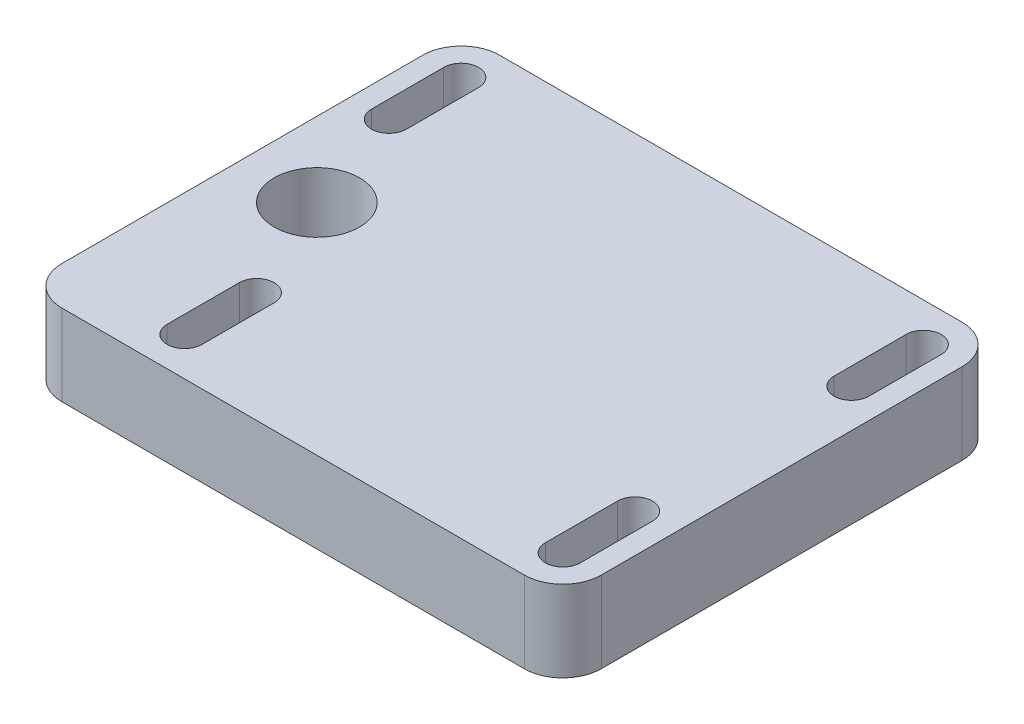
ISO-10303-21;
HEADER;
FILE_DESCRIPTION(('STEP AP214'),'2;1');
FILE_NAME('part.step','',(''),(''),'','','');
FILE_SCHEMA(('AUTOMOTIVE_DESIGN { 1 0 10303 214 1 1 1 1 }'));
ENDSEC;
DATA;
#1=APPLICATION_CONTEXT('core data for automotive mechanical design processes');
#2=APPLICATION_PROTOCOL_DEFINITION('international standard','automotive_design',2000,#1);
#3=PRODUCT_CONTEXT('',#1,'mechanical');
#4=PRODUCT('Part','Part','',(#3));
#5=PRODUCT_RELATED_PRODUCT_CATEGORY('part','',(#4));
#6=PRODUCT_DEFINITION_FORMATION('','',#4);
#7=PRODUCT_DEFINITION_CONTEXT('part definition',#1,'design');
#8=PRODUCT_DEFINITION('design','',#6,#7);
#9=PRODUCT_DEFINITION_SHAPE('','',#8);
#10=(LENGTH_UNIT() NAMED_UNIT(*) SI_UNIT(.MILLI.,.METRE.));
#11=(NAMED_UNIT(*) PLANE_ANGLE_UNIT() SI_UNIT($,.RADIAN.));
#12=(NAMED_UNIT(*) SI_UNIT($,.STERADIAN.) SOLID_ANGLE_UNIT());
#13=UNCERTAINTY_MEASURE_WITH_UNIT(LENGTH_MEASURE(1.E-05),#10,'distance_accuracy_value','');
#14=(GEOMETRIC_REPRESENTATION_CONTEXT(3) GLOBAL_UNCERTAINTY_ASSIGNED_CONTEXT((#13)) GLOBAL_UNIT_ASSIGNED_CONTEXT((#10,
#11,#12)) REPRESENTATION_CONTEXT('',''));
#15=CARTESIAN_POINT('',(0.,0.,0.));
#16=DIRECTION('',(0.,0.,1.));
#17=DIRECTION('',(1.,0.,0.));
#18=AXIS2_PLACEMENT_3D('',#15,#16,#17);
#19=CARTESIAN_POINT('',(0.,6.55,0.));
#20=DIRECTION('',(0.,1.,0.));
#21=DIRECTION('',(0.,0.,1.));
#22=AXIS2_PLACEMENT_3D('',#19,#20,#21);
#23=PLANE('',#22);
#24=CARTESIAN_POINT('',(10.,6.55,-3.00000000000002));
#25=DIRECTION('',(0.,1.,0.));
#26=DIRECTION('',(0.,0.,1.));
#27=AXIS2_PLACEMENT_3D('',#24,#25,#26);
#28=CIRCLE('',#27,1.45);
#29=CARTESIAN_POINT('',(8.55,6.55,-3.00000000000002));
#30=VERTEX_POINT('',#29);
#31=CARTESIAN_POINT('',(11.45,6.55,-3.00000000000002));
#32=VERTEX_POINT('',#31);
#33=EDGE_CURVE('E232',#30,#32,#28,.T.);
#34=ORIENTED_EDGE('',*,*,#33,.F.);
#35=DIRECTION('',(0.,0.,1.));
#36=VECTOR('',#35,1.);
#37=CARTESIAN_POINT('',(8.55000000000001,6.55,0.));
#38=LINE('',#37,#36);
#39=CARTESIAN_POINT('',(8.55,6.55,-9.00000000000002));
#40=VERTEX_POINT('',#39);
#41=EDGE_CURVE('E242',#40,#30,#38,.T.);
#42=ORIENTED_EDGE('',*,*,#41,.F.);
#43=CARTESIAN_POINT('',(10.,6.55,-9.00000000000002));
#44=DIRECTION('',(0.,1.,0.));
#45=DIRECTION('',(0.,0.,1.));
#46=AXIS2_PLACEMENT_3D('',#43,#44,#45);
#47=CIRCLE('',#46,1.45);
#48=CARTESIAN_POINT('',(11.45,6.55,-9.00000000000002));
#49=VERTEX_POINT('',#48);
#50=EDGE_CURVE('E231',#49,#40,#47,.T.);
#51=ORIENTED_EDGE('',*,*,#50,.F.);
#52=DIRECTION('',(0.,0.,-1.));
#53=VECTOR('',#52,1.);
#54=CARTESIAN_POINT('',(11.45,6.55,0.));
#55=LINE('',#54,#53);
#56=EDGE_CURVE('E228',#32,#49,#55,.T.);
#57=ORIENTED_EDGE('',*,*,#56,.F.);
#58=EDGE_LOOP('',(#34,#42,#51,#57));
#59=FACE_BOUND('',#58,.T.);
#60=CARTESIAN_POINT('',(41.45,6.55,-3.00000000000002));
#61=DIRECTION('',(0.,1.,0.));
#62=DIRECTION('',(0.,0.,1.));
#63=AXIS2_PLACEMENT_3D('',#60,#61,#62);
#64=CIRCLE('',#63,1.45);
#65=CARTESIAN_POINT('',(40.,6.55,-3.00000000000002));
#66=VERTEX_POINT('',#65);
#67=CARTESIAN_POINT('',(42.9,6.55,-3.00000000000002));
#68=VERTEX_POINT('',#67);
#69=EDGE_CURVE('E249',#66,#68,#64,.T.);
#70=ORIENTED_EDGE('',*,*,#69,.F.);
#71=DIRECTION('',(0.,0.,1.));
#72=VECTOR('',#71,1.);
#73=CARTESIAN_POINT('',(40.,6.55,0.));
#74=LINE('',#73,#72);
#75=CARTESIAN_POINT('',(40.,6.55,-9.00000000000002));
#76=VERTEX_POINT('',#75);
#77=EDGE_CURVE('E253',#76,#66,#74,.T.);
#78=ORIENTED_EDGE('',*,*,#77,.F.);
#79=CARTESIAN_POINT('',(41.45,6.55,-9.00000000000002));
#80=DIRECTION('',(0.,1.,0.));
#81=DIRECTION('',(0.,0.,1.));
#82=AXIS2_PLACEMENT_3D('',#79,#80,#81);
#83=CIRCLE('',#82,1.45);
#84=CARTESIAN_POINT('',(42.9,6.55,-9.00000000000002));
#85=VERTEX_POINT('',#84);
#86=EDGE_CURVE('E257',#85,#76,#83,.T.);
#87=ORIENTED_EDGE('',*,*,#86,.F.);
#88=DIRECTION('',(0.,0.,-1.));
#89=VECTOR('',#88,1.);
#90=CARTESIAN_POINT('',(42.9,6.55,0.));
#91=LINE('',#90,#89);
#92=EDGE_CURVE('E252',#68,#85,#91,.T.);
#93=ORIENTED_EDGE('',*,*,#92,.F.);
#94=EDGE_LOOP('',(#70,#78,#87,#93));
#95=FACE_BOUND('',#94,.T.);
#96=CARTESIAN_POINT('',(41.45,6.55,-33.));
#97=DIRECTION('',(0.,1.,0.));
#98=DIRECTION('',(0.,0.,1.));
#99=AXIS2_PLACEMENT_3D('',#96,#97,#98);
#100=CIRCLE('',#99,1.45);
#101=CARTESIAN_POINT('',(42.9,6.55,-33.));
#102=VERTEX_POINT('',#101);
#103=CARTESIAN_POINT('',(40.,6.55,-33.));
#104=VERTEX_POINT('',#103);
#105=EDGE_CURVE('E262',#102,#104,#100,.T.);
#106=ORIENTED_EDGE('',*,*,#105,.F.);
#107=DIRECTION('',(0.,0.,-1.));
#108=VECTOR('',#107,1.);
#109=CARTESIAN_POINT('',(42.9,6.55,0.));
#110=LINE('',#109,#108);
#111=CARTESIAN_POINT('',(42.9,6.55,-27.));
#112=VERTEX_POINT('',#111);
#113=EDGE_CURVE('E266',#112,#102,#110,.T.);
#114=ORIENTED_EDGE('',*,*,#113,.F.);
#115=CARTESIAN_POINT('',(41.45,6.55,-27.));
#116=DIRECTION('',(0.,1.,0.));
#117=DIRECTION('',(0.,0.,1.));
#118=AXIS2_PLACEMENT_3D('',#115,#116,#117);
#119=CIRCLE('',#118,1.45);
#120=CARTESIAN_POINT('',(40.,6.55,-27.));
#121=VERTEX_POINT('',#120);
#122=EDGE_CURVE('E270',#121,#112,#119,.T.);
#123=ORIENTED_EDGE('',*,*,#122,.F.);
#124=DIRECTION('',(0.,0.,1.));
#125=VECTOR('',#124,1.);
#126=CARTESIAN_POINT('',(40.,6.55,0.));
#127=LINE('',#126,#125);
#128=EDGE_CURVE('E264',#104,#121,#127,.T.);
#129=ORIENTED_EDGE('',*,*,#128,.F.);
#130=EDGE_LOOP('',(#106,#114,#123,#129));
#131=FACE_BOUND('',#130,.T.);
#132=CARTESIAN_POINT('',(3.,6.55,-33.));
#133=DIRECTION('',(0.,1.,0.));
#134=DIRECTION('',(0.,0.,1.));
#135=AXIS2_PLACEMENT_3D('',#132,#133,#134);
#136=CIRCLE('',#135,1.45);
#137=CARTESIAN_POINT('',(4.45,6.55,-33.));
#138=VERTEX_POINT('',#137);
#139=CARTESIAN_POINT('',(1.55,6.55,-33.));
#140=VERTEX_POINT('',#139);
#141=EDGE_CURVE('E275',#138,#140,#136,.T.);
#142=ORIENTED_EDGE('',*,*,#141,.F.);
#143=DIRECTION('',(0.,0.,-1.));
#144=VECTOR('',#143,1.);
#145=CARTESIAN_POINT('',(4.45,6.55,0.));
#146=LINE('',#145,#144);
#147=CARTESIAN_POINT('',(4.45,6.55,-27.));
#148=VERTEX_POINT('',#147);
#149=EDGE_CURVE('E198',#148,#138,#146,.T.);
#150=ORIENTED_EDGE('',*,*,#149,.F.);
#151=CARTESIAN_POINT('',(3.,6.55,-27.));
#152=DIRECTION('',(0.,1.,0.));
#153=DIRECTION('',(0.,0.,1.));
#154=AXIS2_PLACEMENT_3D('',#151,#152,#153);
#155=CIRCLE('',#154,1.45);
#156=CARTESIAN_POINT('',(1.55,6.55,-27.));
#157=VERTEX_POINT('',#156);
#158=EDGE_CURVE('E280',#157,#148,#155,.T.);
#159=ORIENTED_EDGE('',*,*,#158,.F.);
#160=DIRECTION('',(0.,0.,1.));
#161=VECTOR('',#160,1.);
#162=CARTESIAN_POINT('',(1.55,6.55,0.));
#163=LINE('',#162,#161);
#164=EDGE_CURVE('E277',#140,#157,#163,.T.);
#165=ORIENTED_EDGE('',*,*,#164,.F.);
#166=EDGE_LOOP('',(#142,#150,#159,#165));
#167=FACE_BOUND('',#166,.T.);
#168=DIRECTION('',(0.,0.,1.));
#169=VECTOR('',#168,1.);
#170=CARTESIAN_POINT('',(-0.2,6.55,-36.));
#171=LINE('',#170,#169);
#172=CARTESIAN_POINT('',(-0.2,6.55,-33.));
#173=VERTEX_POINT('',#172);
#174=CARTESIAN_POINT('',(-0.2,6.55,-3.));
#175=VERTEX_POINT('',#174);
#176=EDGE_CURVE('E405',#173,#175,#171,.T.);
#177=ORIENTED_EDGE('',*,*,#176,.T.);
#178=CARTESIAN_POINT('',(3.,6.55,-3.));
#179=DIRECTION('',(0.,1.,0.));
#180=DIRECTION('',(0.,0.,1.));
#181=AXIS2_PLACEMENT_3D('',#178,#179,#180);
#182=CIRCLE('',#181,3.2);
#183=CARTESIAN_POINT('',(3.,6.55,0.2));
#184=VERTEX_POINT('',#183);
#185=EDGE_CURVE('E411',#175,#184,#182,.T.);
#186=ORIENTED_EDGE('',*,*,#185,.T.);
#187=DIRECTION('',(1.,0.,0.));
#188=VECTOR('',#187,1.);
#189=CARTESIAN_POINT('',(0.,6.55,0.2));
#190=LINE('',#189,#188);
#191=CARTESIAN_POINT('',(41.45,6.55,0.2));
#192=VERTEX_POINT('',#191);
#193=EDGE_CURVE('E388',#184,#192,#190,.T.);
#194=ORIENTED_EDGE('',*,*,#193,.T.);
#195=CARTESIAN_POINT('',(41.45,6.55,-3.));
#196=DIRECTION('',(0.,1.,0.));
#197=DIRECTION('',(0.,0.,1.));
#198=AXIS2_PLACEMENT_3D('',#195,#196,#197);
#199=CIRCLE('',#198,3.2);
#200=CARTESIAN_POINT('',(44.65,6.55,-3.));
#201=VERTEX_POINT('',#200);
#202=EDGE_CURVE('E394',#192,#201,#199,.T.);
#203=ORIENTED_EDGE('',*,*,#202,.T.);
#204=DIRECTION('',(0.,0.,-1.));
#205=VECTOR('',#204,1.);
#206=CARTESIAN_POINT('',(44.65,6.55,0.));
#207=LINE('',#206,#205);
#208=CARTESIAN_POINT('',(44.65,6.55,-33.));
#209=VERTEX_POINT('',#208);
#210=EDGE_CURVE('E385',#201,#209,#207,.T.);
#211=ORIENTED_EDGE('',*,*,#210,.T.);
#212=CARTESIAN_POINT('',(41.45,6.55,-33.));
#213=DIRECTION('',(0.,1.,0.));
#214=DIRECTION('',(0.,0.,1.));
#215=AXIS2_PLACEMENT_3D('',#212,#213,#214);
#216=CIRCLE('',#215,3.2);
#217=CARTESIAN_POINT('',(41.45,6.55,-36.2));
#218=VERTEX_POINT('',#217);
#219=EDGE_CURVE('E397',#209,#218,#216,.T.);
#220=ORIENTED_EDGE('',*,*,#219,.T.);
#221=DIRECTION('',(-1.,0.,0.));
#222=VECTOR('',#221,1.);
#223=CARTESIAN_POINT('',(0.,6.55,-36.2));
#224=LINE('',#223,#222);
#225=CARTESIAN_POINT('',(3.,6.55,-36.2));
#226=VERTEX_POINT('',#225);
#227=EDGE_CURVE('E387',#218,#226,#224,.T.);
#228=ORIENTED_EDGE('',*,*,#227,.T.);
#229=CARTESIAN_POINT('',(3.,6.55,-33.));
#230=DIRECTION('',(0.,1.,0.));
#231=DIRECTION('',(0.,0.,1.));
#232=AXIS2_PLACEMENT_3D('',#229,#230,#231);
#233=CIRCLE('',#232,3.2);
#234=EDGE_CURVE('E396',#226,#173,#233,.T.);
#235=ORIENTED_EDGE('',*,*,#234,.T.);
#236=EDGE_LOOP('',(#177,#186,#194,#203,#211,#220,#228,#235));
#237=FACE_BOUND('',#236,.T.);
#238=CARTESIAN_POINT('',(6.,6.55,-18.));
#239=DIRECTION('',(0.,1.,0.));
#240=DIRECTION('',(0.,0.,1.));
#241=AXIS2_PLACEMENT_3D('',#238,#239,#240);
#242=CIRCLE('',#241,3.55);
#243=CARTESIAN_POINT('',(6.,6.55,-14.45));
#244=VERTEX_POINT('',#243);
#245=EDGE_CURVE('E227',#244,#244,#242,.T.);
#246=ORIENTED_EDGE('',*,*,#245,.F.);
#247=EDGE_LOOP('',(#246));
#248=FACE_BOUND('',#247,.T.);
#249=ADVANCED_FACE('F36',(#59,#95,#131,#167,#237,#248),#23,.T.);
#250=CARTESIAN_POINT('',(0.,-0.2,0.));
#251=DIRECTION('',(0.,1.,0.));
#252=DIRECTION('',(0.,0.,1.));
#253=AXIS2_PLACEMENT_3D('',#250,#251,#252);
#254=PLANE('',#253);
#255=DIRECTION('',(0.,0.,1.));
#256=VECTOR('',#255,1.);
#257=CARTESIAN_POINT('',(8.55000000000001,-0.2,0.));
#258=LINE('',#257,#256);
#259=CARTESIAN_POINT('',(8.55,-0.2,-9.00000000000002));
#260=VERTEX_POINT('',#259);
#261=CARTESIAN_POINT('',(8.55,-0.2,-3.00000000000002));
#262=VERTEX_POINT('',#261);
#263=EDGE_CURVE('E239',#260,#262,#258,.T.);
#264=ORIENTED_EDGE('',*,*,#263,.T.);
#265=CARTESIAN_POINT('',(10.,-0.2,-3.00000000000002));
#266=DIRECTION('',(0.,1.,0.));
#267=DIRECTION('',(0.,0.,1.));
#268=AXIS2_PLACEMENT_3D('',#265,#266,#267);
#269=CIRCLE('',#268,1.45);
#270=CARTESIAN_POINT('',(11.45,-0.2,-3.00000000000002));
#271=VERTEX_POINT('',#270);
#272=EDGE_CURVE('E247',#262,#271,#269,.T.);
#273=ORIENTED_EDGE('',*,*,#272,.T.);
#274=DIRECTION('',(0.,0.,-1.));
#275=VECTOR('',#274,1.);
#276=CARTESIAN_POINT('',(11.45,-0.2,0.));
#277=LINE('',#276,#275);
#278=CARTESIAN_POINT('',(11.45,-0.2,-9.00000000000002));
#279=VERTEX_POINT('',#278);
#280=EDGE_CURVE('E373',#271,#279,#277,.T.);
#281=ORIENTED_EDGE('',*,*,#280,.T.);
#282=CARTESIAN_POINT('',(10.,-0.2,-9.00000000000002));
#283=DIRECTION('',(0.,1.,0.));
#284=DIRECTION('',(0.,0.,1.));
#285=AXIS2_PLACEMENT_3D('',#282,#283,#284);
#286=CIRCLE('',#285,1.45);
#287=EDGE_CURVE('E370',#279,#260,#286,.T.);
#288=ORIENTED_EDGE('',*,*,#287,.T.);
#289=EDGE_LOOP('',(#264,#273,#281,#288));
#290=FACE_BOUND('',#289,.T.);
#291=DIRECTION('',(0.,0.,1.));
#292=VECTOR('',#291,1.);
#293=CARTESIAN_POINT('',(40.,-0.2,0.));
#294=LINE('',#293,#292);
#295=CARTESIAN_POINT('',(40.,-0.2,-9.00000000000002));
#296=VERTEX_POINT('',#295);
#297=CARTESIAN_POINT('',(40.,-0.2,-3.00000000000002));
#298=VERTEX_POINT('',#297);
#299=EDGE_CURVE('E294',#296,#298,#294,.T.);
#300=ORIENTED_EDGE('',*,*,#299,.T.);
#301=CARTESIAN_POINT('',(41.45,-0.2,-3.00000000000002));
#302=DIRECTION('',(0.,1.,0.));
#303=DIRECTION('',(0.,0.,1.));
#304=AXIS2_PLACEMENT_3D('',#301,#302,#303);
#305=CIRCLE('',#304,1.45);
#306=CARTESIAN_POINT('',(42.9,-0.2,-3.00000000000002));
#307=VERTEX_POINT('',#306);
#308=EDGE_CURVE('E256',#298,#307,#305,.T.);
#309=ORIENTED_EDGE('',*,*,#308,.T.);
#310=DIRECTION('',(0.,0.,-1.));
#311=VECTOR('',#310,1.);
#312=CARTESIAN_POINT('',(42.9,-0.2,0.));
#313=LINE('',#312,#311);
#314=CARTESIAN_POINT('',(42.9,-0.2,-9.00000000000002));
#315=VERTEX_POINT('',#314);
#316=EDGE_CURVE('E363',#307,#315,#313,.T.);
#317=ORIENTED_EDGE('',*,*,#316,.T.);
#318=CARTESIAN_POINT('',(41.45,-0.2,-9.00000000000002));
#319=DIRECTION('',(0.,1.,0.));
#320=DIRECTION('',(0.,0.,1.));
#321=AXIS2_PLACEMENT_3D('',#318,#319,#320);
#322=CIRCLE('',#321,1.45);
#323=EDGE_CURVE('E360',#315,#296,#322,.T.);
#324=ORIENTED_EDGE('',*,*,#323,.T.);
#325=EDGE_LOOP('',(#300,#309,#317,#324));
#326=FACE_BOUND('',#325,.T.);
#327=DIRECTION('',(0.,0.,-1.));
#328=VECTOR('',#327,1.);
#329=CARTESIAN_POINT('',(42.9,-0.2,0.));
#330=LINE('',#329,#328);
#331=CARTESIAN_POINT('',(42.9,-0.2,-27.));
#332=VERTEX_POINT('',#331);
#333=CARTESIAN_POINT('',(42.9,-0.2,-33.));
#334=VERTEX_POINT('',#333);
#335=EDGE_CURVE('E303',#332,#334,#330,.T.);
#336=ORIENTED_EDGE('',*,*,#335,.T.);
#337=CARTESIAN_POINT('',(41.45,-0.2,-33.));
#338=DIRECTION('',(0.,1.,0.));
#339=DIRECTION('',(0.,0.,1.));
#340=AXIS2_PLACEMENT_3D('',#337,#338,#339);
#341=CIRCLE('',#340,1.45);
#342=CARTESIAN_POINT('',(40.,-0.2,-33.));
#343=VERTEX_POINT('',#342);
#344=EDGE_CURVE('E269',#334,#343,#341,.T.);
#345=ORIENTED_EDGE('',*,*,#344,.T.);
#346=DIRECTION('',(0.,0.,1.));
#347=VECTOR('',#346,1.);
#348=CARTESIAN_POINT('',(40.,-0.2,0.));
#349=LINE('',#348,#347);
#350=CARTESIAN_POINT('',(40.,-0.2,-27.));
#351=VERTEX_POINT('',#350);
#352=EDGE_CURVE('E351',#343,#351,#349,.T.);
#353=ORIENTED_EDGE('',*,*,#352,.T.);
#354=CARTESIAN_POINT('',(41.45,-0.2,-27.));
#355=DIRECTION('',(0.,1.,0.));
#356=DIRECTION('',(0.,0.,1.));
#357=AXIS2_PLACEMENT_3D('',#354,#355,#356);
#358=CIRCLE('',#357,1.45);
#359=EDGE_CURVE('E221',#351,#332,#358,.T.);
#360=ORIENTED_EDGE('',*,*,#359,.T.);
#361=EDGE_LOOP('',(#336,#345,#353,#360));
#362=FACE_BOUND('',#361,.T.);
#363=DIRECTION('',(0.,0.,-1.));
#364=VECTOR('',#363,1.);
#365=CARTESIAN_POINT('',(4.45,-0.2,0.));
#366=LINE('',#365,#364);
#367=CARTESIAN_POINT('',(4.45,-0.2,-27.));
#368=VERTEX_POINT('',#367);
#369=CARTESIAN_POINT('',(4.45,-0.2,-33.));
#370=VERTEX_POINT('',#369);
#371=EDGE_CURVE('E195',#368,#370,#366,.T.);
#372=ORIENTED_EDGE('',*,*,#371,.T.);
#373=CARTESIAN_POINT('',(3.,-0.2,-33.));
#374=DIRECTION('',(0.,1.,0.));
#375=DIRECTION('',(0.,0.,1.));
#376=AXIS2_PLACEMENT_3D('',#373,#374,#375);
#377=CIRCLE('',#376,1.45);
#378=CARTESIAN_POINT('',(1.55,-0.2,-33.));
#379=VERTEX_POINT('',#378);
#380=EDGE_CURVE('E204',#370,#379,#377,.T.);
#381=ORIENTED_EDGE('',*,*,#380,.T.);
#382=DIRECTION('',(0.,0.,1.));
#383=VECTOR('',#382,1.);
#384=CARTESIAN_POINT('',(1.55,-0.2,0.));
#385=LINE('',#384,#383);
#386=CARTESIAN_POINT('',(1.55,-0.2,-27.));
#387=VERTEX_POINT('',#386);
#388=EDGE_CURVE('E211',#379,#387,#385,.T.);
#389=ORIENTED_EDGE('',*,*,#388,.T.);
#390=CARTESIAN_POINT('',(3.,-0.2,-27.));
#391=DIRECTION('',(0.,1.,0.));
#392=DIRECTION('',(0.,0.,1.));
#393=AXIS2_PLACEMENT_3D('',#390,#391,#392);
#394=CIRCLE('',#393,1.45);
#395=EDGE_CURVE('E215',#387,#368,#394,.T.);
#396=ORIENTED_EDGE('',*,*,#395,.T.);
#397=EDGE_LOOP('',(#372,#381,#389,#396));
#398=FACE_BOUND('',#397,.T.);
#399=DIRECTION('',(1.,0.,0.));
#400=VECTOR('',#399,1.);
#401=CARTESIAN_POINT('',(0.,-0.2,0.2));
#402=LINE('',#401,#400);
#403=CARTESIAN_POINT('',(3.,-0.2,0.2));
#404=VERTEX_POINT('',#403);
#405=CARTESIAN_POINT('',(41.45,-0.2,0.2));
#406=VERTEX_POINT('',#405);
#407=EDGE_CURVE('E384',#404,#406,#402,.T.);
#408=ORIENTED_EDGE('',*,*,#407,.F.);
#409=CARTESIAN_POINT('',(3.,-0.2,-3.));
#410=DIRECTION('',(0.,1.,0.));
#411=DIRECTION('',(0.,0.,1.));
#412=AXIS2_PLACEMENT_3D('',#409,#410,#411);
#413=CIRCLE('',#412,3.2);
#414=CARTESIAN_POINT('',(-0.2,-0.2,-3.));
#415=VERTEX_POINT('',#414);
#416=EDGE_CURVE('E408',#404,#415,#413,.F.);
#417=ORIENTED_EDGE('',*,*,#416,.T.);
#418=DIRECTION('',(0.,0.,1.));
#419=VECTOR('',#418,1.);
#420=CARTESIAN_POINT('',(-0.2,-0.2,-36.));
#421=LINE('',#420,#419);
#422=CARTESIAN_POINT('',(-0.2,-0.2,-33.));
#423=VERTEX_POINT('',#422);
#424=EDGE_CURVE('E287',#423,#415,#421,.T.);
#425=ORIENTED_EDGE('',*,*,#424,.F.);
#426=CARTESIAN_POINT('',(3.,-0.2,-33.));
#427=DIRECTION('',(0.,1.,0.));
#428=DIRECTION('',(0.,0.,1.));
#429=AXIS2_PLACEMENT_3D('',#426,#427,#428);
#430=CIRCLE('',#429,3.2);
#431=CARTESIAN_POINT('',(3.,-0.2,-36.2));
#432=VERTEX_POINT('',#431);
#433=EDGE_CURVE('E392',#423,#432,#430,.F.);
#434=ORIENTED_EDGE('',*,*,#433,.T.);
#435=DIRECTION('',(-1.,0.,0.));
#436=VECTOR('',#435,1.);
#437=CARTESIAN_POINT('',(0.,-0.2,-36.2));
#438=LINE('',#437,#436);
#439=CARTESIAN_POINT('',(41.45,-0.2,-36.2));
#440=VERTEX_POINT('',#439);
#441=EDGE_CURVE('E383',#440,#432,#438,.T.);
#442=ORIENTED_EDGE('',*,*,#441,.F.);
#443=CARTESIAN_POINT('',(41.45,-0.2,-33.));
#444=DIRECTION('',(0.,1.,0.));
#445=DIRECTION('',(0.,0.,1.));
#446=AXIS2_PLACEMENT_3D('',#443,#444,#445);
#447=CIRCLE('',#446,3.2);
#448=CARTESIAN_POINT('',(44.65,-0.2,-33.));
#449=VERTEX_POINT('',#448);
#450=EDGE_CURVE('E393',#440,#449,#447,.F.);
#451=ORIENTED_EDGE('',*,*,#450,.T.);
#452=DIRECTION('',(0.,0.,-1.));
#453=VECTOR('',#452,1.);
#454=CARTESIAN_POINT('',(44.65,-0.2,0.));
#455=LINE('',#454,#453);
#456=CARTESIAN_POINT('',(44.65,-0.2,-3.));
#457=VERTEX_POINT('',#456);
#458=EDGE_CURVE('E380',#457,#449,#455,.T.);
#459=ORIENTED_EDGE('',*,*,#458,.F.);
#460=CARTESIAN_POINT('',(41.45,-0.2,-3.));
#461=DIRECTION('',(0.,1.,0.));
#462=DIRECTION('',(0.,0.,1.));
#463=AXIS2_PLACEMENT_3D('',#460,#461,#462);
#464=CIRCLE('',#463,3.2);
#465=EDGE_CURVE('E390',#457,#406,#464,.F.);
#466=ORIENTED_EDGE('',*,*,#465,.T.);
#467=EDGE_LOOP('',(#408,#417,#425,#434,#442,#451,#459,#466));
#468=FACE_BOUND('',#467,.T.);
#469=CARTESIAN_POINT('',(6.,-0.2,-18.));
#470=DIRECTION('',(0.,1.,0.));
#471=DIRECTION('',(0.,0.,1.));
#472=AXIS2_PLACEMENT_3D('',#469,#470,#471);
#473=CIRCLE('',#472,3.55);
#474=CARTESIAN_POINT('',(6.,-0.2,-14.45));
#475=VERTEX_POINT('',#474);
#476=EDGE_CURVE('E201',#475,#475,#473,.T.);
#477=ORIENTED_EDGE('',*,*,#476,.T.);
#478=EDGE_LOOP('',(#477));
#479=FACE_BOUND('',#478,.T.);
#480=ADVANCED_FACE('F213',(#290,#326,#362,#398,#468,#479),#254,.F.);
#481=CARTESIAN_POINT('',(-0.2,6.35,-36.));
#482=DIRECTION('',(1.,0.,0.));
#483=DIRECTION('',(0.,0.,-1.));
#484=AXIS2_PLACEMENT_3D('',#481,#482,#483);
#485=PLANE('',#484);
#486=ORIENTED_EDGE('',*,*,#424,.T.);
#487=DIRECTION('',(0.,1.,0.));
#488=VECTOR('',#487,1.);
#489=CARTESIAN_POINT('',(-0.2,6.35,-3.));
#490=LINE('',#489,#488);
#491=EDGE_CURVE('E416',#415,#175,#490,.T.);
#492=ORIENTED_EDGE('',*,*,#491,.T.);
#493=ORIENTED_EDGE('',*,*,#176,.F.);
#494=DIRECTION('',(0.,1.,0.));
#495=VECTOR('',#494,1.);
#496=CARTESIAN_POINT('',(-0.2,6.35,-33.));
#497=LINE('',#496,#495);
#498=EDGE_CURVE('E410',#173,#423,#497,.F.);
#499=ORIENTED_EDGE('',*,*,#498,.T.);
#500=EDGE_LOOP('',(#486,#492,#493,#499));
#501=FACE_BOUND('',#500,.T.);
#502=ADVANCED_FACE('F331',(#501),#485,.F.);
#503=CARTESIAN_POINT('',(0.,6.35,0.2));
#504=DIRECTION('',(0.,0.,-1.));
#505=DIRECTION('',(-1.,0.,0.));
#506=AXIS2_PLACEMENT_3D('',#503,#504,#505);
#507=PLANE('',#506);
#508=ORIENTED_EDGE('',*,*,#193,.F.);
#509=DIRECTION('',(0.,1.,0.));
#510=VECTOR('',#509,1.);
#511=CARTESIAN_POINT('',(3.,6.35,0.2));
#512=LINE('',#511,#510);
#513=EDGE_CURVE('E400',#184,#404,#512,.F.);
#514=ORIENTED_EDGE('',*,*,#513,.T.);
#515=ORIENTED_EDGE('',*,*,#407,.T.);
#516=DIRECTION('',(0.,1.,0.));
#517=VECTOR('',#516,1.);
#518=CARTESIAN_POINT('',(41.45,6.35,0.2));
#519=LINE('',#518,#517);
#520=EDGE_CURVE('E398',#406,#192,#519,.T.);
#521=ORIENTED_EDGE('',*,*,#520,.T.);
#522=EDGE_LOOP('',(#508,#514,#515,#521));
#523=FACE_BOUND('',#522,.T.);
#524=ADVANCED_FACE('F456',(#523),#507,.F.);
#525=CARTESIAN_POINT('',(44.65,6.35,0.));
#526=DIRECTION('',(-1.,0.,0.));
#527=DIRECTION('',(0.,0.,1.));
#528=AXIS2_PLACEMENT_3D('',#525,#526,#527);
#529=PLANE('',#528);
#530=ORIENTED_EDGE('',*,*,#210,.F.);
#531=DIRECTION('',(0.,1.,0.));
#532=VECTOR('',#531,1.);
#533=CARTESIAN_POINT('',(44.65,6.35,-3.));
#534=LINE('',#533,#532);
#535=EDGE_CURVE('E12',#201,#457,#534,.F.);
#536=ORIENTED_EDGE('',*,*,#535,.T.);
#537=ORIENTED_EDGE('',*,*,#458,.T.);
#538=DIRECTION('',(0.,1.,0.));
#539=VECTOR('',#538,1.);
#540=CARTESIAN_POINT('',(44.65,6.35,-33.));
#541=LINE('',#540,#539);
#542=EDGE_CURVE('E45',#449,#209,#541,.T.);
#543=ORIENTED_EDGE('',*,*,#542,.T.);
#544=EDGE_LOOP('',(#530,#536,#537,#543));
#545=FACE_BOUND('',#544,.T.);
#546=ADVANCED_FACE('F448',(#545),#529,.F.);
#547=CARTESIAN_POINT('',(0.,6.35,-36.2));
#548=DIRECTION('',(0.,0.,1.));
#549=DIRECTION('',(1.,0.,0.));
#550=AXIS2_PLACEMENT_3D('',#547,#548,#549);
#551=PLANE('',#550);
#552=ORIENTED_EDGE('',*,*,#441,.T.);
#553=DIRECTION('',(0.,1.,0.));
#554=VECTOR('',#553,1.);
#555=CARTESIAN_POINT('',(3.,6.35,-36.2));
#556=LINE('',#555,#554);
#557=EDGE_CURVE('E54',#432,#226,#556,.T.);
#558=ORIENTED_EDGE('',*,*,#557,.T.);
#559=ORIENTED_EDGE('',*,*,#227,.F.);
#560=DIRECTION('',(0.,1.,0.));
#561=VECTOR('',#560,1.);
#562=CARTESIAN_POINT('',(41.45,6.35,-36.2));
#563=LINE('',#562,#561);
#564=EDGE_CURVE('E413',#218,#440,#563,.F.);
#565=ORIENTED_EDGE('',*,*,#564,.T.);
#566=EDGE_LOOP('',(#552,#558,#559,#565));
#567=FACE_BOUND('',#566,.T.);
#568=ADVANCED_FACE('F440',(#567),#551,.F.);
#569=CARTESIAN_POINT('',(6.,6.35,-18.));
#570=DIRECTION('',(0.,-1.,0.));
#571=DIRECTION('',(0.,0.,-1.));
#572=AXIS2_PLACEMENT_3D('',#569,#570,#571);
#573=CYLINDRICAL_SURFACE('',#572,3.55);
#574=ORIENTED_EDGE('',*,*,#245,.T.);
#575=EDGE_LOOP('',(#574));
#576=FACE_BOUND('',#575,.T.);
#577=ORIENTED_EDGE('',*,*,#476,.F.);
#578=EDGE_LOOP('',(#577));
#579=FACE_BOUND('',#578,.T.);
#580=ADVANCED_FACE('F635',(#576,#579),#573,.F.);
#581=CARTESIAN_POINT('',(3.,0.,-33.));
#582=DIRECTION('',(0.,1.,0.));
#583=DIRECTION('',(0.,0.,1.));
#584=AXIS2_PLACEMENT_3D('',#581,#582,#583);
#585=CYLINDRICAL_SURFACE('',#584,1.45);
#586=ORIENTED_EDGE('',*,*,#141,.T.);
#587=DIRECTION('',(0.,1.,0.));
#588=VECTOR('',#587,1.);
#589=CARTESIAN_POINT('',(1.55,0.,-33.));
#590=LINE('',#589,#588);
#591=EDGE_CURVE('E207',#379,#140,#590,.T.);
#592=ORIENTED_EDGE('',*,*,#591,.F.);
#593=ORIENTED_EDGE('',*,*,#380,.F.);
#594=DIRECTION('',(0.,1.,0.));
#595=VECTOR('',#594,1.);
#596=CARTESIAN_POINT('',(4.45,0.,-33.));
#597=LINE('',#596,#595);
#598=EDGE_CURVE('E39',#370,#138,#597,.T.);
#599=ORIENTED_EDGE('',*,*,#598,.T.);
#600=EDGE_LOOP('',(#586,#592,#593,#599));
#601=FACE_BOUND('',#600,.T.);
#602=ADVANCED_FACE('F205',(#601),#585,.F.);
#603=CARTESIAN_POINT('',(4.45,0.,-33.));
#604=DIRECTION('',(1.,0.,0.));
#605=DIRECTION('',(0.,0.,-1.));
#606=AXIS2_PLACEMENT_3D('',#603,#604,#605);
#607=PLANE('',#606);
#608=ORIENTED_EDGE('',*,*,#149,.T.);
#609=ORIENTED_EDGE('',*,*,#598,.F.);
#610=ORIENTED_EDGE('',*,*,#371,.F.);
#611=DIRECTION('',(0.,1.,0.));
#612=VECTOR('',#611,1.);
#613=CARTESIAN_POINT('',(4.45,0.,-27.));
#614=LINE('',#613,#612);
#615=EDGE_CURVE('E202',#368,#148,#614,.T.);
#616=ORIENTED_EDGE('',*,*,#615,.T.);
#617=EDGE_LOOP('',(#608,#609,#610,#616));
#618=FACE_BOUND('',#617,.T.);
#619=ADVANCED_FACE('F193',(#618),#607,.F.);
#620=CARTESIAN_POINT('',(3.,0.,-27.));
#621=DIRECTION('',(0.,1.,0.));
#622=DIRECTION('',(0.,0.,1.));
#623=AXIS2_PLACEMENT_3D('',#620,#621,#622);
#624=CYLINDRICAL_SURFACE('',#623,1.45);
#625=ORIENTED_EDGE('',*,*,#158,.T.);
#626=ORIENTED_EDGE('',*,*,#615,.F.);
#627=ORIENTED_EDGE('',*,*,#395,.F.);
#628=DIRECTION('',(0.,1.,0.));
#629=VECTOR('',#628,1.);
#630=CARTESIAN_POINT('',(1.55,0.,-27.));
#631=LINE('',#630,#629);
#632=EDGE_CURVE('E217',#387,#157,#631,.T.);
#633=ORIENTED_EDGE('',*,*,#632,.T.);
#634=EDGE_LOOP('',(#625,#626,#627,#633));
#635=FACE_BOUND('',#634,.T.);
#636=ADVANCED_FACE('F308',(#635),#624,.F.);
#637=CARTESIAN_POINT('',(1.55,0.,-33.));
#638=DIRECTION('',(-1.,0.,0.));
#639=DIRECTION('',(0.,0.,1.));
#640=AXIS2_PLACEMENT_3D('',#637,#638,#639);
#641=PLANE('',#640);
#642=ORIENTED_EDGE('',*,*,#164,.T.);
#643=ORIENTED_EDGE('',*,*,#632,.F.);
#644=ORIENTED_EDGE('',*,*,#388,.F.);
#645=ORIENTED_EDGE('',*,*,#591,.T.);
#646=EDGE_LOOP('',(#642,#643,#644,#645));
#647=FACE_BOUND('',#646,.T.);
#648=ADVANCED_FACE('F314',(#647),#641,.F.);
#649=CARTESIAN_POINT('',(41.45,0.,-33.));
#650=DIRECTION('',(0.,1.,0.));
#651=DIRECTION('',(0.,0.,1.));
#652=AXIS2_PLACEMENT_3D('',#649,#650,#651);
#653=CYLINDRICAL_SURFACE('',#652,1.45);
#654=ORIENTED_EDGE('',*,*,#105,.T.);
#655=DIRECTION('',(0.,1.,0.));
#656=VECTOR('',#655,1.);
#657=CARTESIAN_POINT('',(40.,0.,-33.));
#658=LINE('',#657,#656);
#659=EDGE_CURVE('E300',#343,#104,#658,.T.);
#660=ORIENTED_EDGE('',*,*,#659,.F.);
#661=ORIENTED_EDGE('',*,*,#344,.F.);
#662=DIRECTION('',(0.,1.,0.));
#663=VECTOR('',#662,1.);
#664=CARTESIAN_POINT('',(42.9,0.,-33.));
#665=LINE('',#664,#663);
#666=EDGE_CURVE('E278',#334,#102,#665,.T.);
#667=ORIENTED_EDGE('',*,*,#666,.T.);
#668=EDGE_LOOP('',(#654,#660,#661,#667));
#669=FACE_BOUND('',#668,.T.);
#670=ADVANCED_FACE('F316',(#669),#653,.F.);
#671=CARTESIAN_POINT('',(42.9,0.,-33.));
#672=DIRECTION('',(1.,0.,0.));
#673=DIRECTION('',(0.,0.,-1.));
#674=AXIS2_PLACEMENT_3D('',#671,#672,#673);
#675=PLANE('',#674);
#676=ORIENTED_EDGE('',*,*,#113,.T.);
#677=ORIENTED_EDGE('',*,*,#666,.F.);
#678=ORIENTED_EDGE('',*,*,#335,.F.);
#679=DIRECTION('',(0.,1.,0.));
#680=VECTOR('',#679,1.);
#681=CARTESIAN_POINT('',(42.9,0.,-27.));
#682=LINE('',#681,#680);
#683=EDGE_CURVE('E299',#332,#112,#682,.T.);
#684=ORIENTED_EDGE('',*,*,#683,.T.);
#685=EDGE_LOOP('',(#676,#677,#678,#684));
#686=FACE_BOUND('',#685,.T.);
#687=ADVANCED_FACE('F322',(#686),#675,.F.);
#688=CARTESIAN_POINT('',(41.45,0.,-27.));
#689=DIRECTION('',(0.,1.,0.));
#690=DIRECTION('',(0.,0.,1.));
#691=AXIS2_PLACEMENT_3D('',#688,#689,#690);
#692=CYLINDRICAL_SURFACE('',#691,1.45);
#693=ORIENTED_EDGE('',*,*,#122,.T.);
#694=ORIENTED_EDGE('',*,*,#683,.F.);
#695=ORIENTED_EDGE('',*,*,#359,.F.);
#696=DIRECTION('',(0.,1.,0.));
#697=VECTOR('',#696,1.);
#698=CARTESIAN_POINT('',(40.,0.,-27.));
#699=LINE('',#698,#697);
#700=EDGE_CURVE('E297',#351,#121,#699,.T.);
#701=ORIENTED_EDGE('',*,*,#700,.T.);
#702=EDGE_LOOP('',(#693,#694,#695,#701));
#703=FACE_BOUND('',#702,.T.);
#704=ADVANCED_FACE('F512',(#703),#692,.F.);
#705=CARTESIAN_POINT('',(40.,0.,-33.));
#706=DIRECTION('',(-1.,0.,0.));
#707=DIRECTION('',(0.,0.,1.));
#708=AXIS2_PLACEMENT_3D('',#705,#706,#707);
#709=PLANE('',#708);
#710=ORIENTED_EDGE('',*,*,#128,.T.);
#711=ORIENTED_EDGE('',*,*,#700,.F.);
#712=ORIENTED_EDGE('',*,*,#352,.F.);
#713=ORIENTED_EDGE('',*,*,#659,.T.);
#714=EDGE_LOOP('',(#710,#711,#712,#713));
#715=FACE_BOUND('',#714,.T.);
#716=ADVANCED_FACE('F348',(#715),#709,.F.);
#717=CARTESIAN_POINT('',(41.45,0.,-3.00000000000002));
#718=DIRECTION('',(0.,1.,0.));
#719=DIRECTION('',(0.,0.,1.));
#720=AXIS2_PLACEMENT_3D('',#717,#718,#719);
#721=CYLINDRICAL_SURFACE('',#720,1.45);
#722=ORIENTED_EDGE('',*,*,#69,.T.);
#723=DIRECTION('',(0.,1.,0.));
#724=VECTOR('',#723,1.);
#725=CARTESIAN_POINT('',(42.9,0.,-3.00000000000002));
#726=LINE('',#725,#724);
#727=EDGE_CURVE('E291',#307,#68,#726,.T.);
#728=ORIENTED_EDGE('',*,*,#727,.F.);
#729=ORIENTED_EDGE('',*,*,#308,.F.);
#730=DIRECTION('',(0.,1.,0.));
#731=VECTOR('',#730,1.);
#732=CARTESIAN_POINT('',(40.,0.,-3.00000000000002));
#733=LINE('',#732,#731);
#734=EDGE_CURVE('E265',#298,#66,#733,.T.);
#735=ORIENTED_EDGE('',*,*,#734,.T.);
#736=EDGE_LOOP('',(#722,#728,#729,#735));
#737=FACE_BOUND('',#736,.T.);
#738=ADVANCED_FACE('F505',(#737),#721,.F.);
#739=CARTESIAN_POINT('',(40.,0.,-3.00000000000002));
#740=DIRECTION('',(-1.,0.,0.));
#741=DIRECTION('',(0.,0.,1.));
#742=AXIS2_PLACEMENT_3D('',#739,#740,#741);
#743=PLANE('',#742);
#744=ORIENTED_EDGE('',*,*,#77,.T.);
#745=ORIENTED_EDGE('',*,*,#734,.F.);
#746=ORIENTED_EDGE('',*,*,#299,.F.);
#747=DIRECTION('',(0.,1.,0.));
#748=VECTOR('',#747,1.);
#749=CARTESIAN_POINT('',(40.,0.,-9.00000000000002));
#750=LINE('',#749,#748);
#751=EDGE_CURVE('E290',#296,#76,#750,.T.);
#752=ORIENTED_EDGE('',*,*,#751,.T.);
#753=EDGE_LOOP('',(#744,#745,#746,#752));
#754=FACE_BOUND('',#753,.T.);
#755=ADVANCED_FACE('F501',(#754),#743,.F.);
#756=CARTESIAN_POINT('',(41.45,0.,-9.00000000000002));
#757=DIRECTION('',(0.,1.,0.));
#758=DIRECTION('',(0.,0.,1.));
#759=AXIS2_PLACEMENT_3D('',#756,#757,#758);
#760=CYLINDRICAL_SURFACE('',#759,1.45);
#761=ORIENTED_EDGE('',*,*,#86,.T.);
#762=ORIENTED_EDGE('',*,*,#751,.F.);
#763=ORIENTED_EDGE('',*,*,#323,.F.);
#764=DIRECTION('',(0.,1.,0.));
#765=VECTOR('',#764,1.);
#766=CARTESIAN_POINT('',(42.9,0.,-9.00000000000002));
#767=LINE('',#766,#765);
#768=EDGE_CURVE('E288',#315,#85,#767,.T.);
#769=ORIENTED_EDGE('',*,*,#768,.T.);
#770=EDGE_LOOP('',(#761,#762,#763,#769));
#771=FACE_BOUND('',#770,.T.);
#772=ADVANCED_FACE('F497',(#771),#760,.F.);
#773=CARTESIAN_POINT('',(42.9,0.,-3.00000000000002));
#774=DIRECTION('',(1.,0.,0.));
#775=DIRECTION('',(0.,0.,-1.));
#776=AXIS2_PLACEMENT_3D('',#773,#774,#775);
#777=PLANE('',#776);
#778=ORIENTED_EDGE('',*,*,#92,.T.);
#779=ORIENTED_EDGE('',*,*,#768,.F.);
#780=ORIENTED_EDGE('',*,*,#316,.F.);
#781=ORIENTED_EDGE('',*,*,#727,.T.);
#782=EDGE_LOOP('',(#778,#779,#780,#781));
#783=FACE_BOUND('',#782,.T.);
#784=ADVANCED_FACE('F493',(#783),#777,.F.);
#785=CARTESIAN_POINT('',(10.,0.,-3.00000000000002));
#786=DIRECTION('',(0.,1.,0.));
#787=DIRECTION('',(0.,0.,1.));
#788=AXIS2_PLACEMENT_3D('',#785,#786,#787);
#789=CYLINDRICAL_SURFACE('',#788,1.45);
#790=ORIENTED_EDGE('',*,*,#33,.T.);
#791=DIRECTION('',(0.,1.,0.));
#792=VECTOR('',#791,1.);
#793=CARTESIAN_POINT('',(11.45,0.,-3.00000000000002));
#794=LINE('',#793,#792);
#795=EDGE_CURVE('E236',#271,#32,#794,.T.);
#796=ORIENTED_EDGE('',*,*,#795,.F.);
#797=ORIENTED_EDGE('',*,*,#272,.F.);
#798=DIRECTION('',(0.,1.,0.));
#799=VECTOR('',#798,1.);
#800=CARTESIAN_POINT('',(8.55,0.,-3.00000000000002));
#801=LINE('',#800,#799);
#802=EDGE_CURVE('E244',#262,#30,#801,.T.);
#803=ORIENTED_EDGE('',*,*,#802,.T.);
#804=EDGE_LOOP('',(#790,#796,#797,#803));
#805=FACE_BOUND('',#804,.T.);
#806=ADVANCED_FACE('F489',(#805),#789,.F.);
#807=CARTESIAN_POINT('',(8.55,0.,-3.00000000000002));
#808=DIRECTION('',(-1.,0.,0.));
#809=DIRECTION('',(0.,0.,1.));
#810=AXIS2_PLACEMENT_3D('',#807,#808,#809);
#811=PLANE('',#810);
#812=ORIENTED_EDGE('',*,*,#41,.T.);
#813=ORIENTED_EDGE('',*,*,#802,.F.);
#814=ORIENTED_EDGE('',*,*,#263,.F.);
#815=DIRECTION('',(0.,1.,0.));
#816=VECTOR('',#815,1.);
#817=CARTESIAN_POINT('',(8.55,0.,-9.00000000000002));
#818=LINE('',#817,#816);
#819=EDGE_CURVE('E235',#260,#40,#818,.T.);
#820=ORIENTED_EDGE('',*,*,#819,.T.);
#821=EDGE_LOOP('',(#812,#813,#814,#820));
#822=FACE_BOUND('',#821,.T.);
#823=ADVANCED_FACE('F485',(#822),#811,.F.);
#824=CARTESIAN_POINT('',(10.,0.,-9.00000000000002));
#825=DIRECTION('',(0.,1.,0.));
#826=DIRECTION('',(0.,0.,1.));
#827=AXIS2_PLACEMENT_3D('',#824,#825,#826);
#828=CYLINDRICAL_SURFACE('',#827,1.45);
#829=ORIENTED_EDGE('',*,*,#50,.T.);
#830=ORIENTED_EDGE('',*,*,#819,.F.);
#831=ORIENTED_EDGE('',*,*,#287,.F.);
#832=DIRECTION('',(0.,1.,0.));
#833=VECTOR('',#832,1.);
#834=CARTESIAN_POINT('',(11.45,0.,-9.00000000000002));
#835=LINE('',#834,#833);
#836=EDGE_CURVE('E233',#279,#49,#835,.T.);
#837=ORIENTED_EDGE('',*,*,#836,.T.);
#838=EDGE_LOOP('',(#829,#830,#831,#837));
#839=FACE_BOUND('',#838,.T.);
#840=ADVANCED_FACE('F481',(#839),#828,.F.);
#841=CARTESIAN_POINT('',(11.45,0.,-3.00000000000002));
#842=DIRECTION('',(1.,0.,0.));
#843=DIRECTION('',(0.,0.,-1.));
#844=AXIS2_PLACEMENT_3D('',#841,#842,#843);
#845=PLANE('',#844);
#846=ORIENTED_EDGE('',*,*,#56,.T.);
#847=ORIENTED_EDGE('',*,*,#836,.F.);
#848=ORIENTED_EDGE('',*,*,#280,.F.);
#849=ORIENTED_EDGE('',*,*,#795,.T.);
#850=EDGE_LOOP('',(#846,#847,#848,#849));
#851=FACE_BOUND('',#850,.T.);
#852=ADVANCED_FACE('F475',(#851),#845,.F.);
#853=CARTESIAN_POINT('',(3.,6.35,-3.));
#854=DIRECTION('',(0.,-1.,0.));
#855=DIRECTION('',(0.,0.,-1.));
#856=AXIS2_PLACEMENT_3D('',#853,#854,#855);
#857=CYLINDRICAL_SURFACE('',#856,3.2);
#858=ORIENTED_EDGE('',*,*,#185,.F.);
#859=ORIENTED_EDGE('',*,*,#491,.F.);
#860=ORIENTED_EDGE('',*,*,#416,.F.);
#861=ORIENTED_EDGE('',*,*,#513,.F.);
#862=EDGE_LOOP('',(#858,#859,#860,#861));
#863=FACE_BOUND('',#862,.T.);
#864=ADVANCED_FACE('F460',(#863),#857,.T.);
#865=CARTESIAN_POINT('',(3.,6.35,-33.));
#866=DIRECTION('',(0.,-1.,0.));
#867=DIRECTION('',(0.,0.,-1.));
#868=AXIS2_PLACEMENT_3D('',#865,#866,#867);
#869=CYLINDRICAL_SURFACE('',#868,3.2);
#870=ORIENTED_EDGE('',*,*,#234,.F.);
#871=ORIENTED_EDGE('',*,*,#557,.F.);
#872=ORIENTED_EDGE('',*,*,#433,.F.);
#873=ORIENTED_EDGE('',*,*,#498,.F.);
#874=EDGE_LOOP('',(#870,#871,#872,#873));
#875=FACE_BOUND('',#874,.T.);
#876=ADVANCED_FACE('F467',(#875),#869,.T.);
#877=CARTESIAN_POINT('',(41.45,6.35,-3.));
#878=DIRECTION('',(0.,-1.,0.));
#879=DIRECTION('',(0.,0.,-1.));
#880=AXIS2_PLACEMENT_3D('',#877,#878,#879);
#881=CYLINDRICAL_SURFACE('',#880,3.2);
#882=ORIENTED_EDGE('',*,*,#202,.F.);
#883=ORIENTED_EDGE('',*,*,#520,.F.);
#884=ORIENTED_EDGE('',*,*,#465,.F.);
#885=ORIENTED_EDGE('',*,*,#535,.F.);
#886=EDGE_LOOP('',(#882,#883,#884,#885));
#887=FACE_BOUND('',#886,.T.);
#888=ADVANCED_FACE('F452',(#887),#881,.T.);
#889=CARTESIAN_POINT('',(41.45,6.35,-33.));
#890=DIRECTION('',(0.,-1.,0.));
#891=DIRECTION('',(0.,0.,-1.));
#892=AXIS2_PLACEMENT_3D('',#889,#890,#891);
#893=CYLINDRICAL_SURFACE('',#892,3.2);
#894=ORIENTED_EDGE('',*,*,#219,.F.);
#895=ORIENTED_EDGE('',*,*,#542,.F.);
#896=ORIENTED_EDGE('',*,*,#450,.F.);
#897=ORIENTED_EDGE('',*,*,#564,.F.);
#898=EDGE_LOOP('',(#894,#895,#896,#897));
#899=FACE_BOUND('',#898,.T.);
#900=ADVANCED_FACE('F443',(#899),#893,.T.);
#901=CLOSED_SHELL('',(#249,#480,#502,#524,#546,#568,#580,#602,#619,#636,#648,#670,#687,#704,
#716,#738,#755,#772,#784,#806,#823,#840,#852,#864,#876,#888,#900));
#902=MANIFOLD_SOLID_BREP('B2',#901);
#903=ADVANCED_BREP_SHAPE_REPRESENTATION('',(#18,#902),#14);
#904=SHAPE_DEFINITION_REPRESENTATION(#9,#903);
ENDSEC;
END-ISO-10303-21;
